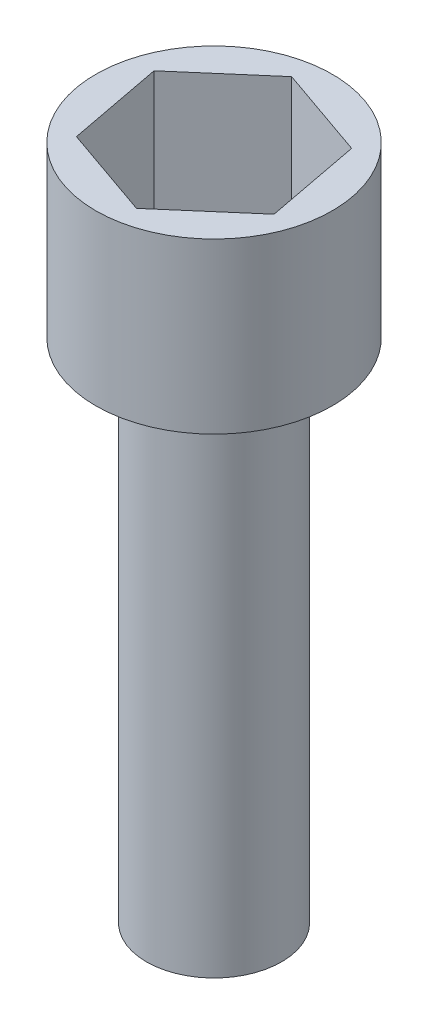
ISO-10303-21;
HEADER;
FILE_DESCRIPTION(('STEP AP214'),'2;1');
FILE_NAME('part.step','',(''),(''),'','','');
FILE_SCHEMA(('AUTOMOTIVE_DESIGN { 1 0 10303 214 1 1 1 1 }'));
ENDSEC;
DATA;
#1=APPLICATION_CONTEXT('core data for automotive mechanical design processes');
#2=APPLICATION_PROTOCOL_DEFINITION('international standard','automotive_design',2000,#1);
#3=PRODUCT_CONTEXT('',#1,'mechanical');
#4=PRODUCT('Part','Part','',(#3));
#5=PRODUCT_RELATED_PRODUCT_CATEGORY('part','',(#4));
#6=PRODUCT_DEFINITION_FORMATION('','',#4);
#7=PRODUCT_DEFINITION_CONTEXT('part definition',#1,'design');
#8=PRODUCT_DEFINITION('design','',#6,#7);
#9=PRODUCT_DEFINITION_SHAPE('','',#8);
#10=(LENGTH_UNIT() NAMED_UNIT(*) SI_UNIT(.MILLI.,.METRE.));
#11=(NAMED_UNIT(*) PLANE_ANGLE_UNIT() SI_UNIT($,.RADIAN.));
#12=(NAMED_UNIT(*) SI_UNIT($,.STERADIAN.) SOLID_ANGLE_UNIT());
#13=UNCERTAINTY_MEASURE_WITH_UNIT(LENGTH_MEASURE(1.E-05),#10,'distance_accuracy_value','');
#14=(GEOMETRIC_REPRESENTATION_CONTEXT(3) GLOBAL_UNCERTAINTY_ASSIGNED_CONTEXT((#13)) GLOBAL_UNIT_ASSIGNED_CONTEXT((#10,
#11,#12)) REPRESENTATION_CONTEXT('',''));
#15=CARTESIAN_POINT('',(0.,0.,0.));
#16=DIRECTION('',(0.,0.,1.));
#17=DIRECTION('',(1.,0.,0.));
#18=AXIS2_PLACEMENT_3D('',#15,#16,#17);
#19=CARTESIAN_POINT('',(0.,15.,0.));
#20=DIRECTION('',(0.,-1.,0.));
#21=DIRECTION('',(0.,0.,-1.));
#22=AXIS2_PLACEMENT_3D('',#19,#20,#21);
#23=CYLINDRICAL_SURFACE('',#22,2.);
#24=CARTESIAN_POINT('',(0.,15.,0.));
#25=DIRECTION('',(0.,1.,0.));
#26=DIRECTION('',(0.,0.,1.));
#27=AXIS2_PLACEMENT_3D('',#24,#25,#26);
#28=CIRCLE('',#27,2.);
#29=CARTESIAN_POINT('',(0.,15.,2.));
#30=VERTEX_POINT('',#29);
#31=EDGE_CURVE('E11',#30,#30,#28,.T.);
#32=ORIENTED_EDGE('',*,*,#31,.F.);
#33=EDGE_LOOP('',(#32));
#34=FACE_BOUND('',#33,.T.);
#35=CARTESIAN_POINT('',(0.,0.,0.));
#36=DIRECTION('',(0.,1.,0.));
#37=DIRECTION('',(0.,0.,1.));
#38=AXIS2_PLACEMENT_3D('',#35,#36,#37);
#39=CIRCLE('',#38,2.);
#40=CARTESIAN_POINT('',(0.,0.,2.));
#41=VERTEX_POINT('',#40);
#42=EDGE_CURVE('E36',#41,#41,#39,.T.);
#43=ORIENTED_EDGE('',*,*,#42,.T.);
#44=EDGE_LOOP('',(#43));
#45=FACE_BOUND('',#44,.T.);
#46=ADVANCED_FACE('F33',(#34,#45),#23,.T.);
#47=CARTESIAN_POINT('',(0.,0.,0.));
#48=DIRECTION('',(0.,1.,0.));
#49=DIRECTION('',(0.,0.,1.));
#50=AXIS2_PLACEMENT_3D('',#47,#48,#49);
#51=PLANE('',#50);
#52=ORIENTED_EDGE('',*,*,#42,.F.);
#53=EDGE_LOOP('',(#52));
#54=FACE_BOUND('',#53,.T.);
#55=ADVANCED_FACE('F151',(#54),#51,.F.);
#56=CARTESIAN_POINT('',(0.,15.,0.));
#57=DIRECTION('',(0.,1.,0.));
#58=DIRECTION('',(0.,0.,1.));
#59=AXIS2_PLACEMENT_3D('',#56,#57,#58);
#60=PLANE('',#59);
#61=CARTESIAN_POINT('',(0.,15.,0.));
#62=DIRECTION('',(0.,1.,0.));
#63=DIRECTION('',(0.,0.,1.));
#64=AXIS2_PLACEMENT_3D('',#61,#62,#63);
#65=CIRCLE('',#64,3.5);
#66=CARTESIAN_POINT('',(0.,15.,3.5));
#67=VERTEX_POINT('',#66);
#68=EDGE_CURVE('E134',#67,#67,#65,.T.);
#69=ORIENTED_EDGE('',*,*,#68,.F.);
#70=EDGE_LOOP('',(#69));
#71=FACE_BOUND('',#70,.T.);
#72=ORIENTED_EDGE('',*,*,#31,.T.);
#73=EDGE_LOOP('',(#72));
#74=FACE_BOUND('',#73,.T.);
#75=ADVANCED_FACE('F148',(#71,#74),#60,.F.);
#76=CARTESIAN_POINT('',(0.,20.,0.));
#77=DIRECTION('',(0.,-1.,0.));
#78=DIRECTION('',(0.,0.,-1.));
#79=AXIS2_PLACEMENT_3D('',#76,#77,#78);
#80=CYLINDRICAL_SURFACE('',#79,3.5);
#81=CARTESIAN_POINT('',(0.,20.,0.));
#82=DIRECTION('',(0.,1.,0.));
#83=DIRECTION('',(0.,0.,1.));
#84=AXIS2_PLACEMENT_3D('',#81,#82,#83);
#85=CIRCLE('',#84,3.5);
#86=CARTESIAN_POINT('',(0.,20.,3.5));
#87=VERTEX_POINT('',#86);
#88=EDGE_CURVE('E140',#87,#87,#85,.T.);
#89=ORIENTED_EDGE('',*,*,#88,.F.);
#90=EDGE_LOOP('',(#89));
#91=FACE_BOUND('',#90,.T.);
#92=ORIENTED_EDGE('',*,*,#68,.T.);
#93=EDGE_LOOP('',(#92));
#94=FACE_BOUND('',#93,.T.);
#95=ADVANCED_FACE('F146',(#91,#94),#80,.T.);
#96=CARTESIAN_POINT('',(0.,20.,0.));
#97=DIRECTION('',(0.,1.,0.));
#98=DIRECTION('',(0.,0.,1.));
#99=AXIS2_PLACEMENT_3D('',#96,#97,#98);
#100=PLANE('',#99);
#101=DIRECTION('',(0.944266096339941,0.,0.329183139457246));
#102=VECTOR('',#101,1.);
#103=CARTESIAN_POINT('',(-2.18588856091437,20.,1.88553030540404));
#104=LINE('',#103,#102);
#105=CARTESIAN_POINT('',(-2.18588856091437,20.,1.88553030540404));
#106=VERTEX_POINT('',#105);
#107=CARTESIAN_POINT('',(0.539972863628139,20.,2.83580017629567));
#108=VERTEX_POINT('',#107);
#109=EDGE_CURVE('E47',#106,#108,#104,.T.);
#110=ORIENTED_EDGE('',*,*,#109,.F.);
#111=DIRECTION('',(0.18705208690248,0.,0.982349997091376));
#112=VECTOR('',#111,1.);
#113=CARTESIAN_POINT('',(-2.72586142454251,20.,-0.950269870891636));
#114=LINE('',#113,#112);
#115=CARTESIAN_POINT('',(-2.72586142454251,20.,-0.950269870891636));
#116=VERTEX_POINT('',#115);
#117=EDGE_CURVE('E130',#116,#106,#114,.T.);
#118=ORIENTED_EDGE('',*,*,#117,.F.);
#119=DIRECTION('',(-0.757214009437461,0.,0.65316685763413));
#120=VECTOR('',#119,1.);
#121=CARTESIAN_POINT('',(-0.53997286362814,20.,-2.83580017629567));
#122=LINE('',#121,#120);
#123=CARTESIAN_POINT('',(-0.53997286362814,20.,-2.83580017629567));
#124=VERTEX_POINT('',#123);
#125=EDGE_CURVE('E128',#124,#116,#122,.T.);
#126=ORIENTED_EDGE('',*,*,#125,.F.);
#127=DIRECTION('',(-0.944266096339941,0.,-0.329183139457246));
#128=VECTOR('',#127,1.);
#129=CARTESIAN_POINT('',(2.18588856091437,20.,-1.88553030540404));
#130=LINE('',#129,#128);
#131=CARTESIAN_POINT('',(2.18588856091437,20.,-1.88553030540404));
#132=VERTEX_POINT('',#131);
#133=EDGE_CURVE('E95',#132,#124,#130,.T.);
#134=ORIENTED_EDGE('',*,*,#133,.F.);
#135=DIRECTION('',(-0.18705208690248,0.,-0.982349997091376));
#136=VECTOR('',#135,1.);
#137=CARTESIAN_POINT('',(2.72586142454251,20.,0.950269870891635));
#138=LINE('',#137,#136);
#139=CARTESIAN_POINT('',(2.72586142454251,20.,0.950269870891635));
#140=VERTEX_POINT('',#139);
#141=EDGE_CURVE('E124',#140,#132,#138,.T.);
#142=ORIENTED_EDGE('',*,*,#141,.F.);
#143=DIRECTION('',(0.757214009437461,0.,-0.65316685763413));
#144=VECTOR('',#143,1.);
#145=CARTESIAN_POINT('',(0.539972863628139,20.,2.83580017629567));
#146=LINE('',#145,#144);
#147=EDGE_CURVE('E121',#108,#140,#146,.T.);
#148=ORIENTED_EDGE('',*,*,#147,.F.);
#149=EDGE_LOOP('',(#110,#118,#126,#134,#142,#148));
#150=FACE_BOUND('',#149,.T.);
#151=ORIENTED_EDGE('',*,*,#88,.T.);
#152=EDGE_LOOP('',(#151));
#153=FACE_BOUND('',#152,.T.);
#154=ADVANCED_FACE('F165',(#150,#153),#100,.T.);
#155=CARTESIAN_POINT('',(-2.18588856091437,16.,1.88553030540404));
#156=DIRECTION('',(-0.329183139457246,0.,0.944266096339941));
#157=DIRECTION('',(0.944266096339941,0.,0.329183139457246));
#158=AXIS2_PLACEMENT_3D('',#155,#156,#157);
#159=PLANE('',#158);
#160=ORIENTED_EDGE('',*,*,#109,.T.);
#161=DIRECTION('',(0.,1.,0.));
#162=VECTOR('',#161,1.);
#163=CARTESIAN_POINT('',(0.539972863628139,16.,2.83580017629567));
#164=LINE('',#163,#162);
#165=CARTESIAN_POINT('',(0.539972863628139,16.,2.83580017629567));
#166=VERTEX_POINT('',#165);
#167=EDGE_CURVE('E77',#166,#108,#164,.T.);
#168=ORIENTED_EDGE('',*,*,#167,.F.);
#169=DIRECTION('',(0.944266096339941,0.,0.329183139457246));
#170=VECTOR('',#169,1.);
#171=CARTESIAN_POINT('',(-2.18588856091437,16.,1.88553030540404));
#172=LINE('',#171,#170);
#173=CARTESIAN_POINT('',(-2.18588856091437,16.,1.88553030540404));
#174=VERTEX_POINT('',#173);
#175=EDGE_CURVE('E132',#174,#166,#172,.T.);
#176=ORIENTED_EDGE('',*,*,#175,.F.);
#177=DIRECTION('',(0.,1.,0.));
#178=VECTOR('',#177,1.);
#179=CARTESIAN_POINT('',(-2.18588856091437,16.,1.88553030540404));
#180=LINE('',#179,#178);
#181=EDGE_CURVE('E55',#174,#106,#180,.T.);
#182=ORIENTED_EDGE('',*,*,#181,.T.);
#183=EDGE_LOOP('',(#160,#168,#176,#182));
#184=FACE_BOUND('',#183,.T.);
#185=ADVANCED_FACE('F170',(#184),#159,.F.);
#186=CARTESIAN_POINT('',(-2.72586142454251,16.,-0.950269870891636));
#187=DIRECTION('',(-0.982349997091376,0.,0.18705208690248));
#188=DIRECTION('',(0.18705208690248,0.,0.982349997091376));
#189=AXIS2_PLACEMENT_3D('',#186,#187,#188);
#190=PLANE('',#189);
#191=ORIENTED_EDGE('',*,*,#117,.T.);
#192=ORIENTED_EDGE('',*,*,#181,.F.);
#193=DIRECTION('',(0.18705208690248,0.,0.982349997091376));
#194=VECTOR('',#193,1.);
#195=CARTESIAN_POINT('',(-2.72586142454251,16.,-0.950269870891636));
#196=LINE('',#195,#194);
#197=CARTESIAN_POINT('',(-2.72586142454251,16.,-0.950269870891636));
#198=VERTEX_POINT('',#197);
#199=EDGE_CURVE('E107',#198,#174,#196,.T.);
#200=ORIENTED_EDGE('',*,*,#199,.F.);
#201=DIRECTION('',(0.,1.,0.));
#202=VECTOR('',#201,1.);
#203=CARTESIAN_POINT('',(-2.72586142454251,16.,-0.950269870891636));
#204=LINE('',#203,#202);
#205=EDGE_CURVE('E99',#198,#116,#204,.T.);
#206=ORIENTED_EDGE('',*,*,#205,.T.);
#207=EDGE_LOOP('',(#191,#192,#200,#206));
#208=FACE_BOUND('',#207,.T.);
#209=ADVANCED_FACE('F174',(#208),#190,.F.);
#210=CARTESIAN_POINT('',(-0.53997286362814,16.,-2.83580017629567));
#211=DIRECTION('',(-0.65316685763413,0.,-0.757214009437461));
#212=DIRECTION('',(-0.757214009437461,0.,0.65316685763413));
#213=AXIS2_PLACEMENT_3D('',#210,#211,#212);
#214=PLANE('',#213);
#215=ORIENTED_EDGE('',*,*,#125,.T.);
#216=ORIENTED_EDGE('',*,*,#205,.F.);
#217=DIRECTION('',(-0.757214009437461,0.,0.65316685763413));
#218=VECTOR('',#217,1.);
#219=CARTESIAN_POINT('',(-0.53997286362814,16.,-2.83580017629567));
#220=LINE('',#219,#218);
#221=CARTESIAN_POINT('',(-0.53997286362814,16.,-2.83580017629567));
#222=VERTEX_POINT('',#221);
#223=EDGE_CURVE('E103',#222,#198,#220,.T.);
#224=ORIENTED_EDGE('',*,*,#223,.F.);
#225=DIRECTION('',(0.,1.,0.));
#226=VECTOR('',#225,1.);
#227=CARTESIAN_POINT('',(-0.53997286362814,16.,-2.83580017629567));
#228=LINE('',#227,#226);
#229=EDGE_CURVE('E88',#222,#124,#228,.T.);
#230=ORIENTED_EDGE('',*,*,#229,.T.);
#231=EDGE_LOOP('',(#215,#216,#224,#230));
#232=FACE_BOUND('',#231,.T.);
#233=ADVANCED_FACE('F104',(#232),#214,.F.);
#234=CARTESIAN_POINT('',(2.18588856091437,16.,-1.88553030540404));
#235=DIRECTION('',(0.329183139457246,0.,-0.944266096339941));
#236=DIRECTION('',(-0.944266096339941,0.,-0.329183139457246));
#237=AXIS2_PLACEMENT_3D('',#234,#235,#236);
#238=PLANE('',#237);
#239=ORIENTED_EDGE('',*,*,#133,.T.);
#240=ORIENTED_EDGE('',*,*,#229,.F.);
#241=DIRECTION('',(-0.944266096339941,0.,-0.329183139457246));
#242=VECTOR('',#241,1.);
#243=CARTESIAN_POINT('',(2.18588856091437,16.,-1.88553030540404));
#244=LINE('',#243,#242);
#245=CARTESIAN_POINT('',(2.18588856091437,16.,-1.88553030540404));
#246=VERTEX_POINT('',#245);
#247=EDGE_CURVE('E92',#246,#222,#244,.T.);
#248=ORIENTED_EDGE('',*,*,#247,.F.);
#249=DIRECTION('',(0.,1.,0.));
#250=VECTOR('',#249,1.);
#251=CARTESIAN_POINT('',(2.18588856091437,16.,-1.88553030540404));
#252=LINE('',#251,#250);
#253=EDGE_CURVE('E100',#246,#132,#252,.T.);
#254=ORIENTED_EDGE('',*,*,#253,.T.);
#255=EDGE_LOOP('',(#239,#240,#248,#254));
#256=FACE_BOUND('',#255,.T.);
#257=ADVANCED_FACE('F90',(#256),#238,.F.);
#258=CARTESIAN_POINT('',(2.72586142454251,16.,0.950269870891635));
#259=DIRECTION('',(0.982349997091376,0.,-0.18705208690248));
#260=DIRECTION('',(-0.18705208690248,0.,-0.982349997091376));
#261=AXIS2_PLACEMENT_3D('',#258,#259,#260);
#262=PLANE('',#261);
#263=ORIENTED_EDGE('',*,*,#141,.T.);
#264=ORIENTED_EDGE('',*,*,#253,.F.);
#265=DIRECTION('',(-0.18705208690248,0.,-0.982349997091376));
#266=VECTOR('',#265,1.);
#267=CARTESIAN_POINT('',(2.72586142454251,16.,0.950269870891635));
#268=LINE('',#267,#266);
#269=CARTESIAN_POINT('',(2.72586142454251,16.,0.950269870891635));
#270=VERTEX_POINT('',#269);
#271=EDGE_CURVE('E113',#270,#246,#268,.T.);
#272=ORIENTED_EDGE('',*,*,#271,.F.);
#273=DIRECTION('',(0.,1.,0.));
#274=VECTOR('',#273,1.);
#275=CARTESIAN_POINT('',(2.72586142454251,16.,0.950269870891635));
#276=LINE('',#275,#274);
#277=EDGE_CURVE('E137',#270,#140,#276,.T.);
#278=ORIENTED_EDGE('',*,*,#277,.T.);
#279=EDGE_LOOP('',(#263,#264,#272,#278));
#280=FACE_BOUND('',#279,.T.);
#281=ADVANCED_FACE('F178',(#280),#262,.F.);
#282=CARTESIAN_POINT('',(0.539972863628139,16.,2.83580017629567));
#283=DIRECTION('',(0.65316685763413,0.,0.757214009437461));
#284=DIRECTION('',(0.757214009437461,0.,-0.65316685763413));
#285=AXIS2_PLACEMENT_3D('',#282,#283,#284);
#286=PLANE('',#285);
#287=ORIENTED_EDGE('',*,*,#147,.T.);
#288=ORIENTED_EDGE('',*,*,#277,.F.);
#289=DIRECTION('',(0.757214009437461,0.,-0.65316685763413));
#290=VECTOR('',#289,1.);
#291=CARTESIAN_POINT('',(0.539972863628139,16.,2.83580017629567));
#292=LINE('',#291,#290);
#293=EDGE_CURVE('E115',#166,#270,#292,.T.);
#294=ORIENTED_EDGE('',*,*,#293,.F.);
#295=ORIENTED_EDGE('',*,*,#167,.T.);
#296=EDGE_LOOP('',(#287,#288,#294,#295));
#297=FACE_BOUND('',#296,.T.);
#298=ADVANCED_FACE('F175',(#297),#286,.F.);
#299=CARTESIAN_POINT('',(0.,16.,0.));
#300=DIRECTION('',(0.,1.,0.));
#301=DIRECTION('',(0.,0.,1.));
#302=AXIS2_PLACEMENT_3D('',#299,#300,#301);
#303=PLANE('',#302);
#304=ORIENTED_EDGE('',*,*,#175,.T.);
#305=ORIENTED_EDGE('',*,*,#293,.T.);
#306=ORIENTED_EDGE('',*,*,#271,.T.);
#307=ORIENTED_EDGE('',*,*,#247,.T.);
#308=ORIENTED_EDGE('',*,*,#223,.T.);
#309=ORIENTED_EDGE('',*,*,#199,.T.);
#310=EDGE_LOOP('',(#304,#305,#306,#307,#308,#309));
#311=FACE_BOUND('',#310,.T.);
#312=ADVANCED_FACE('F110',(#311),#303,.T.);
#313=CLOSED_SHELL('',(#46,#55,#75,#95,#154,#185,#209,#233,#257,#281,#298,#312));
#314=MANIFOLD_SOLID_BREP('B2',#313);
#315=ADVANCED_BREP_SHAPE_REPRESENTATION('',(#18,#314),#14);
#316=SHAPE_DEFINITION_REPRESENTATION(#9,#315);
ENDSEC;
END-ISO-10303-21;
